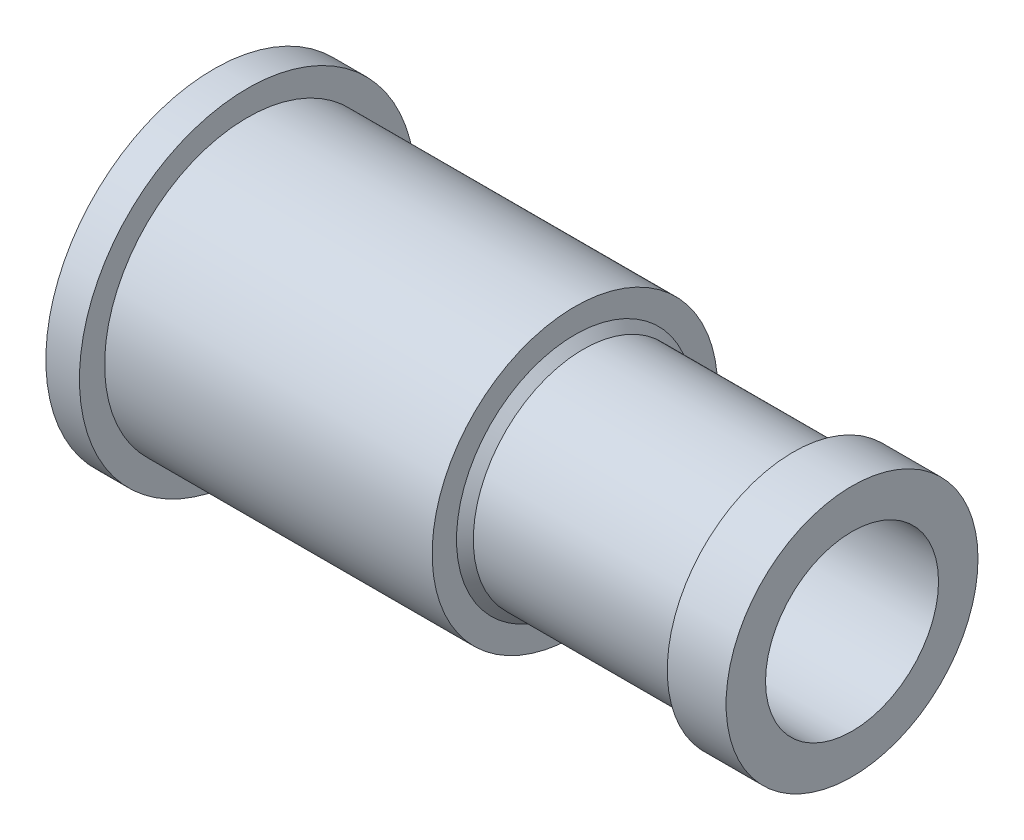
ISO-10303-21;
HEADER;
FILE_DESCRIPTION(('STEP AP214'),'2;1');
FILE_NAME('part.step','',(''),(''),'','','');
FILE_SCHEMA(('AUTOMOTIVE_DESIGN { 1 0 10303 214 1 1 1 1 }'));
ENDSEC;
DATA;
#1=APPLICATION_CONTEXT('core data for automotive mechanical design processes');
#2=APPLICATION_PROTOCOL_DEFINITION('international standard','automotive_design',2000,#1);
#3=PRODUCT_CONTEXT('',#1,'mechanical');
#4=PRODUCT('Part','Part','',(#3));
#5=PRODUCT_RELATED_PRODUCT_CATEGORY('part','',(#4));
#6=PRODUCT_DEFINITION_FORMATION('','',#4);
#7=PRODUCT_DEFINITION_CONTEXT('part definition',#1,'design');
#8=PRODUCT_DEFINITION('design','',#6,#7);
#9=PRODUCT_DEFINITION_SHAPE('','',#8);
#10=(LENGTH_UNIT() NAMED_UNIT(*) SI_UNIT(.MILLI.,.METRE.));
#11=(NAMED_UNIT(*) PLANE_ANGLE_UNIT() SI_UNIT($,.RADIAN.));
#12=(NAMED_UNIT(*) SI_UNIT($,.STERADIAN.) SOLID_ANGLE_UNIT());
#13=UNCERTAINTY_MEASURE_WITH_UNIT(LENGTH_MEASURE(1.E-05),#10,'distance_accuracy_value','');
#14=(GEOMETRIC_REPRESENTATION_CONTEXT(3) GLOBAL_UNCERTAINTY_ASSIGNED_CONTEXT((#13)) GLOBAL_UNIT_ASSIGNED_CONTEXT((#10,
#11,#12)) REPRESENTATION_CONTEXT('',''));
#15=CARTESIAN_POINT('',(0.,0.,0.));
#16=DIRECTION('',(0.,0.,1.));
#17=DIRECTION('',(1.,0.,0.));
#18=AXIS2_PLACEMENT_3D('',#15,#16,#17);
#19=CARTESIAN_POINT('',(39.,0.,0.));
#20=DIRECTION('',(1.,0.,0.));
#21=DIRECTION('',(0.,0.,-1.));
#22=AXIS2_PLACEMENT_3D('',#19,#20,#21);
#23=CYLINDRICAL_SURFACE('',#22,6.7);
#24=CARTESIAN_POINT('',(6.4,0.,0.));
#25=DIRECTION('',(-1.,0.,0.));
#26=DIRECTION('',(0.,0.,1.));
#27=AXIS2_PLACEMENT_3D('',#24,#25,#26);
#28=CIRCLE('',#27,6.7);
#29=CARTESIAN_POINT('',(6.4,0.,6.7));
#30=VERTEX_POINT('',#29);
#31=EDGE_CURVE('E10',#30,#30,#28,.F.);
#32=ORIENTED_EDGE('',*,*,#31,.T.);
#33=EDGE_LOOP('',(#32));
#34=FACE_BOUND('',#33,.T.);
#35=CARTESIAN_POINT('',(1.,0.,0.));
#36=DIRECTION('',(1.,0.,0.));
#37=DIRECTION('',(0.,0.,-1.));
#38=AXIS2_PLACEMENT_3D('',#35,#36,#37);
#39=CIRCLE('',#38,6.7);
#40=CARTESIAN_POINT('',(1.,0.,-6.7));
#41=VERTEX_POINT('',#40);
#42=EDGE_CURVE('E83',#41,#41,#39,.T.);
#43=ORIENTED_EDGE('',*,*,#42,.F.);
#44=EDGE_LOOP('',(#43));
#45=FACE_BOUND('',#44,.T.);
#46=ADVANCED_FACE('F15',(#34,#45),#23,.F.);
#47=CARTESIAN_POINT('',(39.,0.,0.));
#48=DIRECTION('',(1.,0.,0.));
#49=DIRECTION('',(0.,0.,-1.));
#50=AXIS2_PLACEMENT_3D('',#47,#48,#49);
#51=CYLINDRICAL_SURFACE('',#50,5.4);
#52=CARTESIAN_POINT('',(7.7,0.,0.));
#53=DIRECTION('',(-1.,0.,0.));
#54=DIRECTION('',(0.,0.,1.));
#55=AXIS2_PLACEMENT_3D('',#52,#53,#54);
#56=CIRCLE('',#55,5.4);
#57=CARTESIAN_POINT('',(7.7,0.,5.4));
#58=VERTEX_POINT('',#57);
#59=EDGE_CURVE('E23',#58,#58,#56,.T.);
#60=ORIENTED_EDGE('',*,*,#59,.T.);
#61=EDGE_LOOP('',(#60));
#62=FACE_BOUND('',#61,.T.);
#63=CARTESIAN_POINT('',(21.5,0.,0.));
#64=DIRECTION('',(1.,0.,0.));
#65=DIRECTION('',(0.,0.,-1.));
#66=AXIS2_PLACEMENT_3D('',#63,#64,#65);
#67=CIRCLE('',#66,5.4);
#68=CARTESIAN_POINT('',(21.5,0.,-5.4));
#69=VERTEX_POINT('',#68);
#70=EDGE_CURVE('E31',#69,#69,#67,.T.);
#71=ORIENTED_EDGE('',*,*,#70,.T.);
#72=EDGE_LOOP('',(#71));
#73=FACE_BOUND('',#72,.T.);
#74=ADVANCED_FACE('F92',(#62,#73),#51,.F.);
#75=CARTESIAN_POINT('',(21.5,5.4,0.));
#76=DIRECTION('',(-1.,0.,0.));
#77=DIRECTION('',(0.,0.,1.));
#78=AXIS2_PLACEMENT_3D('',#75,#76,#77);
#79=PLANE('',#78);
#80=CARTESIAN_POINT('',(21.5,0.,0.));
#81=DIRECTION('',(1.,0.,0.));
#82=DIRECTION('',(0.,0.,-1.));
#83=AXIS2_PLACEMENT_3D('',#80,#81,#82);
#84=CIRCLE('',#83,5.15);
#85=CARTESIAN_POINT('',(21.5,0.,-5.15));
#86=VERTEX_POINT('',#85);
#87=EDGE_CURVE('E38',#86,#86,#84,.T.);
#88=ORIENTED_EDGE('',*,*,#87,.T.);
#89=EDGE_LOOP('',(#88));
#90=FACE_BOUND('',#89,.T.);
#91=ORIENTED_EDGE('',*,*,#70,.F.);
#92=EDGE_LOOP('',(#91));
#93=FACE_BOUND('',#92,.T.);
#94=ADVANCED_FACE('F97',(#90,#93),#79,.T.);
#95=CARTESIAN_POINT('',(39.,0.,0.));
#96=DIRECTION('',(1.,0.,0.));
#97=DIRECTION('',(0.,0.,-1.));
#98=AXIS2_PLACEMENT_3D('',#95,#96,#97);
#99=CYLINDRICAL_SURFACE('',#98,5.15);
#100=CARTESIAN_POINT('',(39.,0.,0.));
#101=DIRECTION('',(1.,0.,0.));
#102=DIRECTION('',(0.,0.,-1.));
#103=AXIS2_PLACEMENT_3D('',#100,#101,#102);
#104=CIRCLE('',#103,5.15);
#105=CARTESIAN_POINT('',(39.,0.,-5.15));
#106=VERTEX_POINT('',#105);
#107=EDGE_CURVE('E44',#106,#106,#104,.T.);
#108=ORIENTED_EDGE('',*,*,#107,.T.);
#109=EDGE_LOOP('',(#108));
#110=FACE_BOUND('',#109,.T.);
#111=ORIENTED_EDGE('',*,*,#87,.F.);
#112=EDGE_LOOP('',(#111));
#113=FACE_BOUND('',#112,.T.);
#114=ADVANCED_FACE('F102',(#110,#113),#99,.F.);
#115=CARTESIAN_POINT('',(39.,5.15,0.));
#116=DIRECTION('',(1.,0.,0.));
#117=DIRECTION('',(0.,0.,-1.));
#118=AXIS2_PLACEMENT_3D('',#115,#116,#117);
#119=PLANE('',#118);
#120=CARTESIAN_POINT('',(39.,0.,0.));
#121=DIRECTION('',(1.,0.,0.));
#122=DIRECTION('',(0.,0.,-1.));
#123=AXIS2_PLACEMENT_3D('',#120,#121,#122);
#124=CIRCLE('',#123,7.5);
#125=CARTESIAN_POINT('',(39.,0.,-7.5));
#126=VERTEX_POINT('',#125);
#127=EDGE_CURVE('E48',#126,#126,#124,.T.);
#128=ORIENTED_EDGE('',*,*,#127,.T.);
#129=EDGE_LOOP('',(#128));
#130=FACE_BOUND('',#129,.T.);
#131=ORIENTED_EDGE('',*,*,#107,.F.);
#132=EDGE_LOOP('',(#131));
#133=FACE_BOUND('',#132,.T.);
#134=ADVANCED_FACE('F106',(#130,#133),#119,.T.);
#135=CARTESIAN_POINT('',(39.,0.,0.));
#136=DIRECTION('',(1.,0.,0.));
#137=DIRECTION('',(0.,0.,-1.));
#138=AXIS2_PLACEMENT_3D('',#135,#136,#137);
#139=CYLINDRICAL_SURFACE('',#138,7.5);
#140=CARTESIAN_POINT('',(35.5,0.,0.));
#141=DIRECTION('',(1.,0.,0.));
#142=DIRECTION('',(0.,0.,-1.));
#143=AXIS2_PLACEMENT_3D('',#140,#141,#142);
#144=CIRCLE('',#143,7.5);
#145=CARTESIAN_POINT('',(35.5,0.,-7.5));
#146=VERTEX_POINT('',#145);
#147=EDGE_CURVE('E51',#146,#146,#144,.T.);
#148=ORIENTED_EDGE('',*,*,#147,.T.);
#149=EDGE_LOOP('',(#148));
#150=FACE_BOUND('',#149,.T.);
#151=ORIENTED_EDGE('',*,*,#127,.F.);
#152=EDGE_LOOP('',(#151));
#153=FACE_BOUND('',#152,.T.);
#154=ADVANCED_FACE('F110',(#150,#153),#139,.T.);
#155=CARTESIAN_POINT('',(35.5,7.5,0.));
#156=DIRECTION('',(-1.,0.,0.));
#157=DIRECTION('',(0.,0.,1.));
#158=AXIS2_PLACEMENT_3D('',#155,#156,#157);
#159=PLANE('',#158);
#160=CARTESIAN_POINT('',(35.5,0.,0.));
#161=DIRECTION('',(1.,0.,0.));
#162=DIRECTION('',(0.,0.,-1.));
#163=AXIS2_PLACEMENT_3D('',#160,#161,#162);
#164=CIRCLE('',#163,6.55);
#165=CARTESIAN_POINT('',(35.5,0.,-6.55));
#166=VERTEX_POINT('',#165);
#167=EDGE_CURVE('E55',#166,#166,#164,.T.);
#168=ORIENTED_EDGE('',*,*,#167,.T.);
#169=EDGE_LOOP('',(#168));
#170=FACE_BOUND('',#169,.T.);
#171=ORIENTED_EDGE('',*,*,#147,.F.);
#172=EDGE_LOOP('',(#171));
#173=FACE_BOUND('',#172,.T.);
#174=ADVANCED_FACE('F114',(#170,#173),#159,.T.);
#175=CARTESIAN_POINT('',(39.,0.,0.));
#176=DIRECTION('',(1.,0.,0.));
#177=DIRECTION('',(0.,0.,-1.));
#178=AXIS2_PLACEMENT_3D('',#175,#176,#177);
#179=CYLINDRICAL_SURFACE('',#178,6.55);
#180=CARTESIAN_POINT('',(22.9999999999997,0.,0.));
#181=DIRECTION('',(1.,0.,0.));
#182=DIRECTION('',(0.,0.,-1.));
#183=AXIS2_PLACEMENT_3D('',#180,#181,#182);
#184=CIRCLE('',#183,6.55);
#185=CARTESIAN_POINT('',(22.9999999999997,0.,-6.55));
#186=VERTEX_POINT('',#185);
#187=EDGE_CURVE('E59',#186,#186,#184,.T.);
#188=ORIENTED_EDGE('',*,*,#187,.T.);
#189=EDGE_LOOP('',(#188));
#190=FACE_BOUND('',#189,.T.);
#191=ORIENTED_EDGE('',*,*,#167,.F.);
#192=EDGE_LOOP('',(#191));
#193=FACE_BOUND('',#192,.T.);
#194=ADVANCED_FACE('F118',(#190,#193),#179,.T.);
#195=CARTESIAN_POINT('',(22.9999999999997,0.,0.));
#196=DIRECTION('',(-1.,0.,0.));
#197=DIRECTION('',(0.,0.,1.));
#198=AXIS2_PLACEMENT_3D('',#195,#196,#197);
#199=CONICAL_SURFACE('',#198,6.55,0.785398163397446);
#200=CARTESIAN_POINT('',(22.4999999999997,0.,0.));
#201=DIRECTION('',(1.,0.,0.));
#202=DIRECTION('',(0.,0.,-1.));
#203=AXIS2_PLACEMENT_3D('',#200,#201,#202);
#204=CIRCLE('',#203,7.05);
#205=CARTESIAN_POINT('',(22.4999999999997,0.,-7.05));
#206=VERTEX_POINT('',#205);
#207=EDGE_CURVE('E63',#206,#206,#204,.T.);
#208=ORIENTED_EDGE('',*,*,#207,.T.);
#209=EDGE_LOOP('',(#208));
#210=FACE_BOUND('',#209,.T.);
#211=ORIENTED_EDGE('',*,*,#187,.F.);
#212=EDGE_LOOP('',(#211));
#213=FACE_BOUND('',#212,.T.);
#214=ADVANCED_FACE('F122',(#210,#213),#199,.T.);
#215=CARTESIAN_POINT('',(22.4999999999997,7.05,0.));
#216=DIRECTION('',(1.,0.,0.));
#217=DIRECTION('',(0.,0.,-1.));
#218=AXIS2_PLACEMENT_3D('',#215,#216,#217);
#219=PLANE('',#218);
#220=CARTESIAN_POINT('',(22.4999999999997,0.,0.));
#221=DIRECTION('',(1.,0.,0.));
#222=DIRECTION('',(0.,0.,-1.));
#223=AXIS2_PLACEMENT_3D('',#220,#221,#222);
#224=CIRCLE('',#223,8.5);
#225=CARTESIAN_POINT('',(22.4999999999997,0.,-8.5));
#226=VERTEX_POINT('',#225);
#227=EDGE_CURVE('E67',#226,#226,#224,.T.);
#228=ORIENTED_EDGE('',*,*,#227,.T.);
#229=EDGE_LOOP('',(#228));
#230=FACE_BOUND('',#229,.T.);
#231=ORIENTED_EDGE('',*,*,#207,.F.);
#232=EDGE_LOOP('',(#231));
#233=FACE_BOUND('',#232,.T.);
#234=ADVANCED_FACE('F126',(#230,#233),#219,.T.);
#235=CARTESIAN_POINT('',(39.,0.,0.));
#236=DIRECTION('',(1.,0.,0.));
#237=DIRECTION('',(0.,0.,-1.));
#238=AXIS2_PLACEMENT_3D('',#235,#236,#237);
#239=CYLINDRICAL_SURFACE('',#238,8.5);
#240=CARTESIAN_POINT('',(2.99999999999972,0.,0.));
#241=DIRECTION('',(1.,0.,0.));
#242=DIRECTION('',(0.,0.,-1.));
#243=AXIS2_PLACEMENT_3D('',#240,#241,#242);
#244=CIRCLE('',#243,8.5);
#245=CARTESIAN_POINT('',(2.99999999999972,0.,-8.5));
#246=VERTEX_POINT('',#245);
#247=EDGE_CURVE('E71',#246,#246,#244,.T.);
#248=ORIENTED_EDGE('',*,*,#247,.T.);
#249=EDGE_LOOP('',(#248));
#250=FACE_BOUND('',#249,.T.);
#251=ORIENTED_EDGE('',*,*,#227,.F.);
#252=EDGE_LOOP('',(#251));
#253=FACE_BOUND('',#252,.T.);
#254=ADVANCED_FACE('F130',(#250,#253),#239,.T.);
#255=CARTESIAN_POINT('',(2.99999999999972,8.5,0.));
#256=DIRECTION('',(1.,0.,0.));
#257=DIRECTION('',(0.,0.,-1.));
#258=AXIS2_PLACEMENT_3D('',#255,#256,#257);
#259=PLANE('',#258);
#260=CARTESIAN_POINT('',(2.99999999999972,0.,0.));
#261=DIRECTION('',(1.,0.,0.));
#262=DIRECTION('',(0.,0.,-1.));
#263=AXIS2_PLACEMENT_3D('',#260,#261,#262);
#264=CIRCLE('',#263,10.);
#265=CARTESIAN_POINT('',(2.99999999999972,0.,-10.));
#266=VERTEX_POINT('',#265);
#267=EDGE_CURVE('E75',#266,#266,#264,.T.);
#268=ORIENTED_EDGE('',*,*,#267,.T.);
#269=EDGE_LOOP('',(#268));
#270=FACE_BOUND('',#269,.T.);
#271=ORIENTED_EDGE('',*,*,#247,.F.);
#272=EDGE_LOOP('',(#271));
#273=FACE_BOUND('',#272,.T.);
#274=ADVANCED_FACE('F134',(#270,#273),#259,.T.);
#275=CARTESIAN_POINT('',(39.,0.,0.));
#276=DIRECTION('',(1.,0.,0.));
#277=DIRECTION('',(0.,0.,-1.));
#278=AXIS2_PLACEMENT_3D('',#275,#276,#277);
#279=CYLINDRICAL_SURFACE('',#278,10.);
#280=CARTESIAN_POINT('',(1.,0.,0.));
#281=DIRECTION('',(1.,0.,0.));
#282=DIRECTION('',(0.,0.,-1.));
#283=AXIS2_PLACEMENT_3D('',#280,#281,#282);
#284=CIRCLE('',#283,10.);
#285=CARTESIAN_POINT('',(1.,0.,-10.));
#286=VERTEX_POINT('',#285);
#287=EDGE_CURVE('E79',#286,#286,#284,.T.);
#288=ORIENTED_EDGE('',*,*,#287,.T.);
#289=EDGE_LOOP('',(#288));
#290=FACE_BOUND('',#289,.T.);
#291=ORIENTED_EDGE('',*,*,#267,.F.);
#292=EDGE_LOOP('',(#291));
#293=FACE_BOUND('',#292,.T.);
#294=ADVANCED_FACE('F138',(#290,#293),#279,.T.);
#295=CARTESIAN_POINT('',(1.,10.,0.));
#296=DIRECTION('',(-1.,0.,0.));
#297=DIRECTION('',(0.,0.,1.));
#298=AXIS2_PLACEMENT_3D('',#295,#296,#297);
#299=PLANE('',#298);
#300=ORIENTED_EDGE('',*,*,#42,.T.);
#301=EDGE_LOOP('',(#300));
#302=FACE_BOUND('',#301,.T.);
#303=ORIENTED_EDGE('',*,*,#287,.F.);
#304=EDGE_LOOP('',(#303));
#305=FACE_BOUND('',#304,.T.);
#306=ADVANCED_FACE('F88',(#302,#305),#299,.T.);
#307=CARTESIAN_POINT('',(6.2,0.,0.));
#308=DIRECTION('',(-1.,0.,0.));
#309=DIRECTION('',(0.,0.,1.));
#310=AXIS2_PLACEMENT_3D('',#307,#308,#309);
#311=CONICAL_SURFACE('',#310,6.9,0.785398163397448);
#312=ORIENTED_EDGE('',*,*,#59,.F.);
#313=EDGE_LOOP('',(#312));
#314=FACE_BOUND('',#313,.T.);
#315=ORIENTED_EDGE('',*,*,#31,.F.);
#316=EDGE_LOOP('',(#315));
#317=FACE_BOUND('',#316,.T.);
#318=ADVANCED_FACE('F17',(#314,#317),#311,.F.);
#319=CLOSED_SHELL('',(#46,#74,#94,#114,#134,#154,#174,#194,#214,#234,#254,#274,#294,#306,#318));
#320=MANIFOLD_SOLID_BREP('B1',#319);
#321=ADVANCED_BREP_SHAPE_REPRESENTATION('',(#18,#320),#14);
#322=SHAPE_DEFINITION_REPRESENTATION(#9,#321);
ENDSEC;
END-ISO-10303-21;
